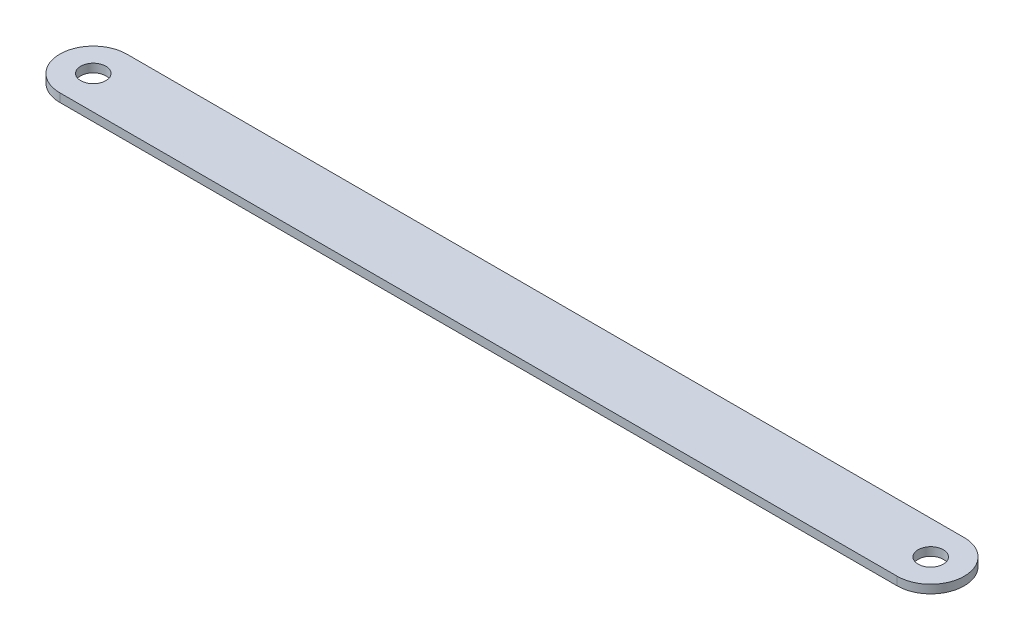
ISO-10303-21;
HEADER;
FILE_DESCRIPTION(('STEP AP214'),'2;1');
FILE_NAME('part.step','',(''),(''),'','','');
FILE_SCHEMA(('AUTOMOTIVE_DESIGN { 1 0 10303 214 1 1 1 1 }'));
ENDSEC;
DATA;
#1=APPLICATION_CONTEXT('core data for automotive mechanical design processes');
#2=APPLICATION_PROTOCOL_DEFINITION('international standard','automotive_design',2000,#1);
#3=PRODUCT_CONTEXT('',#1,'mechanical');
#4=PRODUCT('Part','Part','',(#3));
#5=PRODUCT_RELATED_PRODUCT_CATEGORY('part','',(#4));
#6=PRODUCT_DEFINITION_FORMATION('','',#4);
#7=PRODUCT_DEFINITION_CONTEXT('part definition',#1,'design');
#8=PRODUCT_DEFINITION('design','',#6,#7);
#9=PRODUCT_DEFINITION_SHAPE('','',#8);
#10=(LENGTH_UNIT() NAMED_UNIT(*) SI_UNIT(.MILLI.,.METRE.));
#11=(NAMED_UNIT(*) PLANE_ANGLE_UNIT() SI_UNIT($,.RADIAN.));
#12=(NAMED_UNIT(*) SI_UNIT($,.STERADIAN.) SOLID_ANGLE_UNIT());
#13=UNCERTAINTY_MEASURE_WITH_UNIT(LENGTH_MEASURE(1.E-05),#10,'distance_accuracy_value','');
#14=(GEOMETRIC_REPRESENTATION_CONTEXT(3) GLOBAL_UNCERTAINTY_ASSIGNED_CONTEXT((#13)) GLOBAL_UNIT_ASSIGNED_CONTEXT((#10,
#11,#12)) REPRESENTATION_CONTEXT('',''));
#15=CARTESIAN_POINT('',(0.,0.,0.));
#16=DIRECTION('',(0.,0.,1.));
#17=DIRECTION('',(1.,0.,0.));
#18=AXIS2_PLACEMENT_3D('',#15,#16,#17);
#19=CARTESIAN_POINT('',(50.,1.,0.));
#20=DIRECTION('',(0.,1.,0.));
#21=DIRECTION('',(0.,0.,1.));
#22=AXIS2_PLACEMENT_3D('',#19,#20,#21);
#23=PLANE('',#22);
#24=CARTESIAN_POINT('',(-50.,1.,0.));
#25=DIRECTION('',(0.,1.,0.));
#26=DIRECTION('',(0.,0.,1.));
#27=AXIS2_PLACEMENT_3D('',#24,#25,#26);
#28=CIRCLE('',#27,1.5);
#29=CARTESIAN_POINT('',(-50.,1.,1.50000000000002));
#30=VERTEX_POINT('',#29);
#31=EDGE_CURVE('E100',#30,#30,#28,.T.);
#32=ORIENTED_EDGE('',*,*,#31,.F.);
#33=EDGE_LOOP('',(#32));
#34=FACE_BOUND('',#33,.T.);
#35=CARTESIAN_POINT('',(50.,1.,0.));
#36=DIRECTION('',(0.,1.,0.));
#37=DIRECTION('',(0.,0.,1.));
#38=AXIS2_PLACEMENT_3D('',#35,#36,#37);
#39=CIRCLE('',#38,4.);
#40=CARTESIAN_POINT('',(50.,1.,3.99999999999998));
#41=VERTEX_POINT('',#40);
#42=CARTESIAN_POINT('',(50.,1.,-4.00000000000002));
#43=VERTEX_POINT('',#42);
#44=EDGE_CURVE('E85',#41,#43,#39,.T.);
#45=ORIENTED_EDGE('',*,*,#44,.T.);
#46=DIRECTION('',(-1.,0.,0.));
#47=VECTOR('',#46,1.);
#48=CARTESIAN_POINT('',(50.,1.,-4.00000000000002));
#49=LINE('',#48,#47);
#50=CARTESIAN_POINT('',(-50.,1.,-3.99999999999999));
#51=VERTEX_POINT('',#50);
#52=EDGE_CURVE('E80',#43,#51,#49,.T.);
#53=ORIENTED_EDGE('',*,*,#52,.T.);
#54=CARTESIAN_POINT('',(-50.,1.,0.));
#55=DIRECTION('',(0.,1.,0.));
#56=DIRECTION('',(0.,0.,1.));
#57=AXIS2_PLACEMENT_3D('',#54,#55,#56);
#58=CIRCLE('',#57,4.);
#59=CARTESIAN_POINT('',(-50.,1.,4.00000000000001));
#60=VERTEX_POINT('',#59);
#61=EDGE_CURVE('E83',#51,#60,#58,.T.);
#62=ORIENTED_EDGE('',*,*,#61,.T.);
#63=DIRECTION('',(1.,0.,0.));
#64=VECTOR('',#63,1.);
#65=CARTESIAN_POINT('',(50.,1.,3.99999999999998));
#66=LINE('',#65,#64);
#67=EDGE_CURVE('E50',#60,#41,#66,.T.);
#68=ORIENTED_EDGE('',*,*,#67,.T.);
#69=EDGE_LOOP('',(#45,#53,#62,#68));
#70=FACE_BOUND('',#69,.T.);
#71=CARTESIAN_POINT('',(50.,1.,0.));
#72=DIRECTION('',(0.,1.,0.));
#73=DIRECTION('',(0.,0.,1.));
#74=AXIS2_PLACEMENT_3D('',#71,#72,#73);
#75=CIRCLE('',#74,1.5);
#76=CARTESIAN_POINT('',(50.,1.,1.49999999999999));
#77=VERTEX_POINT('',#76);
#78=EDGE_CURVE('E115',#77,#77,#75,.T.);
#79=ORIENTED_EDGE('',*,*,#78,.F.);
#80=EDGE_LOOP('',(#79));
#81=FACE_BOUND('',#80,.T.);
#82=ADVANCED_FACE('F33',(#34,#70,#81),#23,.T.);
#83=CARTESIAN_POINT('',(50.,0.,0.));
#84=DIRECTION('',(0.,1.,0.));
#85=DIRECTION('',(0.,0.,1.));
#86=AXIS2_PLACEMENT_3D('',#83,#84,#85);
#87=PLANE('',#86);
#88=CARTESIAN_POINT('',(50.,0.,0.));
#89=DIRECTION('',(0.,1.,0.));
#90=DIRECTION('',(0.,0.,1.));
#91=AXIS2_PLACEMENT_3D('',#88,#89,#90);
#92=CIRCLE('',#91,4.);
#93=CARTESIAN_POINT('',(50.,0.,3.99999999999998));
#94=VERTEX_POINT('',#93);
#95=CARTESIAN_POINT('',(50.,0.,-4.00000000000002));
#96=VERTEX_POINT('',#95);
#97=EDGE_CURVE('E97',#94,#96,#92,.T.);
#98=ORIENTED_EDGE('',*,*,#97,.F.);
#99=DIRECTION('',(1.,0.,0.));
#100=VECTOR('',#99,1.);
#101=CARTESIAN_POINT('',(50.,0.,3.99999999999998));
#102=LINE('',#101,#100);
#103=CARTESIAN_POINT('',(-50.,0.,4.00000000000001));
#104=VERTEX_POINT('',#103);
#105=EDGE_CURVE('E73',#104,#94,#102,.T.);
#106=ORIENTED_EDGE('',*,*,#105,.F.);
#107=CARTESIAN_POINT('',(-50.,0.,0.));
#108=DIRECTION('',(0.,1.,0.));
#109=DIRECTION('',(0.,0.,1.));
#110=AXIS2_PLACEMENT_3D('',#107,#108,#109);
#111=CIRCLE('',#110,4.);
#112=CARTESIAN_POINT('',(-50.,0.,-3.99999999999999));
#113=VERTEX_POINT('',#112);
#114=EDGE_CURVE('E67',#113,#104,#111,.T.);
#115=ORIENTED_EDGE('',*,*,#114,.F.);
#116=DIRECTION('',(-1.,0.,0.));
#117=VECTOR('',#116,1.);
#118=CARTESIAN_POINT('',(50.,0.,-4.00000000000002));
#119=LINE('',#118,#117);
#120=EDGE_CURVE('E89',#96,#113,#119,.T.);
#121=ORIENTED_EDGE('',*,*,#120,.F.);
#122=EDGE_LOOP('',(#98,#106,#115,#121));
#123=FACE_BOUND('',#122,.T.);
#124=CARTESIAN_POINT('',(-50.,0.,0.));
#125=DIRECTION('',(0.,1.,0.));
#126=DIRECTION('',(0.,0.,1.));
#127=AXIS2_PLACEMENT_3D('',#124,#125,#126);
#128=CIRCLE('',#127,1.5);
#129=CARTESIAN_POINT('',(-50.,0.,1.50000000000002));
#130=VERTEX_POINT('',#129);
#131=EDGE_CURVE('E112',#130,#130,#128,.T.);
#132=ORIENTED_EDGE('',*,*,#131,.T.);
#133=EDGE_LOOP('',(#132));
#134=FACE_BOUND('',#133,.T.);
#135=CARTESIAN_POINT('',(50.,0.,0.));
#136=DIRECTION('',(0.,1.,0.));
#137=DIRECTION('',(0.,0.,1.));
#138=AXIS2_PLACEMENT_3D('',#135,#136,#137);
#139=CIRCLE('',#138,1.5);
#140=CARTESIAN_POINT('',(50.,0.,1.49999999999999));
#141=VERTEX_POINT('',#140);
#142=EDGE_CURVE('E118',#141,#141,#139,.T.);
#143=ORIENTED_EDGE('',*,*,#142,.T.);
#144=EDGE_LOOP('',(#143));
#145=FACE_BOUND('',#144,.T.);
#146=ADVANCED_FACE('F108',(#123,#134,#145),#87,.F.);
#147=CARTESIAN_POINT('',(50.,1.,0.));
#148=DIRECTION('',(0.,-1.,0.));
#149=DIRECTION('',(0.,0.,-1.));
#150=AXIS2_PLACEMENT_3D('',#147,#148,#149);
#151=CYLINDRICAL_SURFACE('',#150,4.);
#152=ORIENTED_EDGE('',*,*,#97,.T.);
#153=DIRECTION('',(0.,-1.,0.));
#154=VECTOR('',#153,1.);
#155=CARTESIAN_POINT('',(50.,1.,-4.00000000000002));
#156=LINE('',#155,#154);
#157=EDGE_CURVE('E11',#43,#96,#156,.T.);
#158=ORIENTED_EDGE('',*,*,#157,.F.);
#159=ORIENTED_EDGE('',*,*,#44,.F.);
#160=DIRECTION('',(0.,-1.,0.));
#161=VECTOR('',#160,1.);
#162=CARTESIAN_POINT('',(50.,1.,3.99999999999998));
#163=LINE('',#162,#161);
#164=EDGE_CURVE('E93',#41,#94,#163,.T.);
#165=ORIENTED_EDGE('',*,*,#164,.T.);
#166=EDGE_LOOP('',(#152,#158,#159,#165));
#167=FACE_BOUND('',#166,.T.);
#168=ADVANCED_FACE('F35',(#167),#151,.T.);
#169=CARTESIAN_POINT('',(50.,1.,-4.00000000000002));
#170=DIRECTION('',(0.,0.,1.));
#171=DIRECTION('',(1.,0.,0.));
#172=AXIS2_PLACEMENT_3D('',#169,#170,#171);
#173=PLANE('',#172);
#174=ORIENTED_EDGE('',*,*,#120,.T.);
#175=DIRECTION('',(0.,-1.,0.));
#176=VECTOR('',#175,1.);
#177=CARTESIAN_POINT('',(-50.,1.,-3.99999999999999));
#178=LINE('',#177,#176);
#179=EDGE_CURVE('E42',#51,#113,#178,.T.);
#180=ORIENTED_EDGE('',*,*,#179,.F.);
#181=ORIENTED_EDGE('',*,*,#52,.F.);
#182=ORIENTED_EDGE('',*,*,#157,.T.);
#183=EDGE_LOOP('',(#174,#180,#181,#182));
#184=FACE_BOUND('',#183,.T.);
#185=ADVANCED_FACE('F88',(#184),#173,.F.);
#186=CARTESIAN_POINT('',(-50.,1.,0.));
#187=DIRECTION('',(0.,-1.,0.));
#188=DIRECTION('',(0.,0.,-1.));
#189=AXIS2_PLACEMENT_3D('',#186,#187,#188);
#190=CYLINDRICAL_SURFACE('',#189,4.);
#191=ORIENTED_EDGE('',*,*,#114,.T.);
#192=DIRECTION('',(0.,-1.,0.));
#193=VECTOR('',#192,1.);
#194=CARTESIAN_POINT('',(-50.,1.,4.00000000000001));
#195=LINE('',#194,#193);
#196=EDGE_CURVE('E90',#60,#104,#195,.T.);
#197=ORIENTED_EDGE('',*,*,#196,.F.);
#198=ORIENTED_EDGE('',*,*,#61,.F.);
#199=ORIENTED_EDGE('',*,*,#179,.T.);
#200=EDGE_LOOP('',(#191,#197,#198,#199));
#201=FACE_BOUND('',#200,.T.);
#202=ADVANCED_FACE('F91',(#201),#190,.T.);
#203=CARTESIAN_POINT('',(50.,1.,3.99999999999998));
#204=DIRECTION('',(0.,0.,-1.));
#205=DIRECTION('',(-1.,0.,0.));
#206=AXIS2_PLACEMENT_3D('',#203,#204,#205);
#207=PLANE('',#206);
#208=ORIENTED_EDGE('',*,*,#105,.T.);
#209=ORIENTED_EDGE('',*,*,#164,.F.);
#210=ORIENTED_EDGE('',*,*,#67,.F.);
#211=ORIENTED_EDGE('',*,*,#196,.T.);
#212=EDGE_LOOP('',(#208,#209,#210,#211));
#213=FACE_BOUND('',#212,.T.);
#214=ADVANCED_FACE('F105',(#213),#207,.F.);
#215=CARTESIAN_POINT('',(-50.,1.,0.));
#216=DIRECTION('',(0.,-1.,0.));
#217=DIRECTION('',(0.,0.,-1.));
#218=AXIS2_PLACEMENT_3D('',#215,#216,#217);
#219=CYLINDRICAL_SURFACE('',#218,1.5);
#220=ORIENTED_EDGE('',*,*,#31,.T.);
#221=EDGE_LOOP('',(#220));
#222=FACE_BOUND('',#221,.T.);
#223=ORIENTED_EDGE('',*,*,#131,.F.);
#224=EDGE_LOOP('',(#223));
#225=FACE_BOUND('',#224,.T.);
#226=ADVANCED_FACE('F135',(#222,#225),#219,.F.);
#227=CARTESIAN_POINT('',(50.,1.,0.));
#228=DIRECTION('',(0.,-1.,0.));
#229=DIRECTION('',(0.,0.,-1.));
#230=AXIS2_PLACEMENT_3D('',#227,#228,#229);
#231=CYLINDRICAL_SURFACE('',#230,1.5);
#232=ORIENTED_EDGE('',*,*,#78,.T.);
#233=EDGE_LOOP('',(#232));
#234=FACE_BOUND('',#233,.T.);
#235=ORIENTED_EDGE('',*,*,#142,.F.);
#236=EDGE_LOOP('',(#235));
#237=FACE_BOUND('',#236,.T.);
#238=ADVANCED_FACE('F124',(#234,#237),#231,.F.);
#239=CLOSED_SHELL('',(#82,#146,#168,#185,#202,#214,#226,#238));
#240=MANIFOLD_SOLID_BREP('B2',#239);
#241=ADVANCED_BREP_SHAPE_REPRESENTATION('',(#18,#240),#14);
#242=SHAPE_DEFINITION_REPRESENTATION(#9,#241);
ENDSEC;
END-ISO-10303-21;
